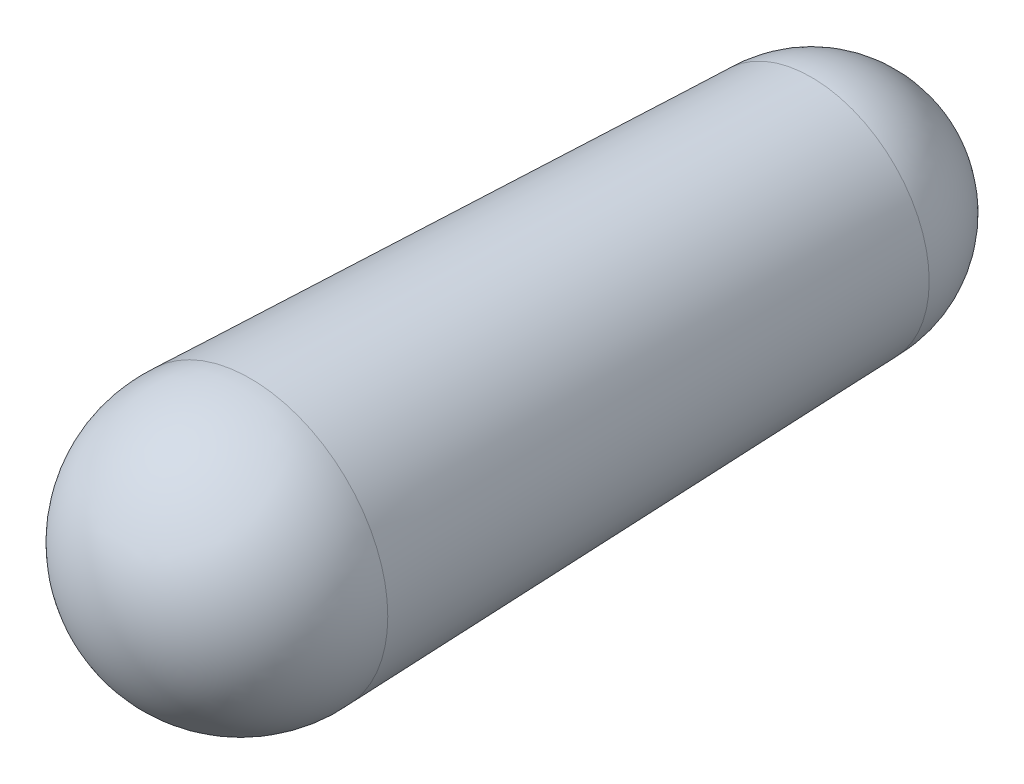
ISO-10303-21;
HEADER;
FILE_DESCRIPTION(('STEP AP214'),'2;1');
FILE_NAME('part.step','',(''),(''),'','','');
FILE_SCHEMA(('AUTOMOTIVE_DESIGN { 1 0 10303 214 1 1 1 1 }'));
ENDSEC;
DATA;
#1=APPLICATION_CONTEXT('core data for automotive mechanical design processes');
#2=APPLICATION_PROTOCOL_DEFINITION('international standard','automotive_design',2000,#1);
#3=PRODUCT_CONTEXT('',#1,'mechanical');
#4=PRODUCT('Part','Part','',(#3));
#5=PRODUCT_RELATED_PRODUCT_CATEGORY('part','',(#4));
#6=PRODUCT_DEFINITION_FORMATION('','',#4);
#7=PRODUCT_DEFINITION_CONTEXT('part definition',#1,'design');
#8=PRODUCT_DEFINITION('design','',#6,#7);
#9=PRODUCT_DEFINITION_SHAPE('','',#8);
#10=(LENGTH_UNIT() NAMED_UNIT(*) SI_UNIT(.MILLI.,.METRE.));
#11=(NAMED_UNIT(*) PLANE_ANGLE_UNIT() SI_UNIT($,.RADIAN.));
#12=(NAMED_UNIT(*) SI_UNIT($,.STERADIAN.) SOLID_ANGLE_UNIT());
#13=UNCERTAINTY_MEASURE_WITH_UNIT(LENGTH_MEASURE(1.E-05),#10,'distance_accuracy_value','');
#14=(GEOMETRIC_REPRESENTATION_CONTEXT(3) GLOBAL_UNCERTAINTY_ASSIGNED_CONTEXT((#13)) GLOBAL_UNIT_ASSIGNED_CONTEXT((#10,
#11,#12)) REPRESENTATION_CONTEXT('',''));
#15=CARTESIAN_POINT('',(0.,0.,0.));
#16=DIRECTION('',(0.,0.,1.));
#17=DIRECTION('',(1.,0.,0.));
#18=AXIS2_PLACEMENT_3D('',#15,#16,#17);
#19=CARTESIAN_POINT('',(0.,0.,0.));
#20=DIRECTION('',(0.,1.,0.));
#21=DIRECTION('',(1.,0.,0.));
#22=AXIS2_PLACEMENT_3D('',#19,#20,#21);
#23=SPHERICAL_SURFACE('',#22,1.69);
#24=CARTESIAN_POINT('',(0.,0.,0.));
#25=DIRECTION('',(0.,0.,-1.));
#26=DIRECTION('',(-1.,0.,0.));
#27=AXIS2_PLACEMENT_3D('',#24,#25,#26);
#28=SPHERICAL_SURFACE('',#27,1.69);
#29=CARTESIAN_POINT('',(0.,0.,-0.117888440625976));
#30=DIRECTION('',(0.,0.,-1.));
#31=DIRECTION('',(-1.,0.,0.));
#32=AXIS2_PLACEMENT_3D('',#29,#30,#31);
#33=CIRCLE('',#32,1.68588324493916);
#34=CARTESIAN_POINT('',(-1.68588324493916,0.,-0.117888440625976));
#35=VERTEX_POINT('',#34);
#36=EDGE_CURVE('E10',#35,#35,#33,.F.);
#37=ORIENTED_EDGE('',*,*,#36,.T.);
#38=EDGE_LOOP('',(#37));
#39=FACE_BOUND('',#38,.T.);
#40=ADVANCED_FACE('F35',(#39),#28,.T.);
#41=CARTESIAN_POINT('',(0.,0.,0.));
#42=DIRECTION('',(0.,0.,1.));
#43=DIRECTION('',(1.,0.,0.));
#44=AXIS2_PLACEMENT_3D('',#41,#42,#43);
#45=CONICAL_SURFACE('',#44,1.69,0.0349065850398866);
#46=CARTESIAN_POINT('',(0.,0.,-7.));
#47=DIRECTION('',(0.,0.,1.));
#48=DIRECTION('',(1.,0.,0.));
#49=AXIS2_PLACEMENT_3D('',#46,#47,#48);
#50=CIRCLE('',#49,1.44555461355777);
#51=CARTESIAN_POINT('',(1.44555461355777,0.,-7.));
#52=VERTEX_POINT('',#51);
#53=EDGE_CURVE('E41',#52,#52,#50,.T.);
#54=ORIENTED_EDGE('',*,*,#53,.T.);
#55=EDGE_LOOP('',(#54));
#56=FACE_BOUND('',#55,.T.);
#57=ORIENTED_EDGE('',*,*,#36,.F.);
#58=EDGE_LOOP('',(#57));
#59=FACE_BOUND('',#58,.T.);
#60=ADVANCED_FACE('F47',(#56,#59),#45,.T.);
#61=CARTESIAN_POINT('',(0.,0.,-7.));
#62=DIRECTION('',(0.,1.,0.));
#63=DIRECTION('',(1.,0.,0.));
#64=AXIS2_PLACEMENT_3D('',#61,#62,#63);
#65=SPHERICAL_SURFACE('',#64,1.44555461355777);
#66=CARTESIAN_POINT('',(0.,0.,-7.));
#67=DIRECTION('',(0.,0.,1.));
#68=DIRECTION('',(1.,0.,0.));
#69=AXIS2_PLACEMENT_3D('',#66,#67,#68);
#70=SPHERICAL_SURFACE('',#69,1.44555461355777);
#71=ORIENTED_EDGE('',*,*,#53,.F.);
#72=EDGE_LOOP('',(#71));
#73=FACE_BOUND('',#72,.T.);
#74=ADVANCED_FACE('F50',(#73),#70,.T.);
#75=CLOSED_SHELL('',(#40,#60,#74));
#76=MANIFOLD_SOLID_BREP('B2',#75);
#77=ADVANCED_BREP_SHAPE_REPRESENTATION('',(#18,#76),#14);
#78=SHAPE_DEFINITION_REPRESENTATION(#9,#77);
ENDSEC;
END-ISO-10303-21;
